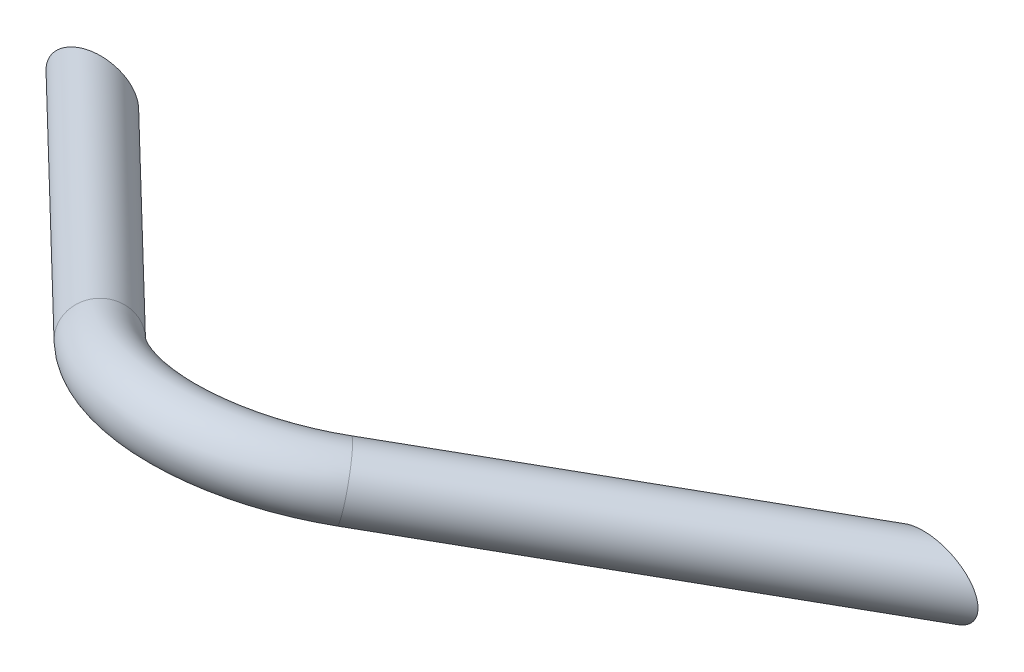
ISO-10303-21;
HEADER;
FILE_DESCRIPTION(('STEP AP214'),'2;1');
FILE_NAME('part.step','',(''),(''),'','','');
FILE_SCHEMA(('AUTOMOTIVE_DESIGN { 1 0 10303 214 1 1 1 1 }'));
ENDSEC;
DATA;
#1=APPLICATION_CONTEXT('core data for automotive mechanical design processes');
#2=APPLICATION_PROTOCOL_DEFINITION('international standard','automotive_design',2000,#1);
#3=PRODUCT_CONTEXT('',#1,'mechanical');
#4=PRODUCT('Part','Part','',(#3));
#5=PRODUCT_RELATED_PRODUCT_CATEGORY('part','',(#4));
#6=PRODUCT_DEFINITION_FORMATION('','',#4);
#7=PRODUCT_DEFINITION_CONTEXT('part definition',#1,'design');
#8=PRODUCT_DEFINITION('design','',#6,#7);
#9=PRODUCT_DEFINITION_SHAPE('','',#8);
#10=(LENGTH_UNIT() NAMED_UNIT(*) SI_UNIT(.MILLI.,.METRE.));
#11=(NAMED_UNIT(*) PLANE_ANGLE_UNIT() SI_UNIT($,.RADIAN.));
#12=(NAMED_UNIT(*) SI_UNIT($,.STERADIAN.) SOLID_ANGLE_UNIT());
#13=UNCERTAINTY_MEASURE_WITH_UNIT(LENGTH_MEASURE(1.E-05),#10,'distance_accuracy_value','');
#14=(GEOMETRIC_REPRESENTATION_CONTEXT(3) GLOBAL_UNCERTAINTY_ASSIGNED_CONTEXT((#13)) GLOBAL_UNIT_ASSIGNED_CONTEXT((#10,
#11,#12)) REPRESENTATION_CONTEXT('',''));
#15=CARTESIAN_POINT('',(0.,0.,0.));
#16=DIRECTION('',(0.,0.,1.));
#17=DIRECTION('',(1.,0.,0.));
#18=AXIS2_PLACEMENT_3D('',#15,#16,#17);
#19=CARTESIAN_POINT('',(228.97810114783,3.07089443601057,84.8810819781346));
#20=DIRECTION('',(0.,0.966420942740906,-0.256964124795229));
#21=DIRECTION('',(0.,0.256964124795229,0.966420942740906));
#22=AXIS2_PLACEMENT_3D('',#19,#20,#21);
#23=TOROIDAL_SURFACE('',#22,84.4977441648282,15.875);
#24=CARTESIAN_POINT('',(168.96518211042,18.3560880897538,142.367438381385));
#25=DIRECTION('',(0.703968676885562,0.182503892491773,0.686382132044055));
#26=DIRECTION('',(0.698106743490784,0.,-0.715993697383358));
#27=AXIS2_PLACEMENT_3D('',#24,#25,#26);
#28=CIRCLE('',#27,15.875);
#29=CARTESIAN_POINT('',(157.690264665754,21.2277913719129,153.167678280351));
#30=VERTEX_POINT('',#29);
#31=EDGE_CURVE('E40',#30,#30,#28,.F.);
#32=CARTESIAN_POINT('',(288.991020185241,18.3560880897538,142.367438381385));
#33=DIRECTION('',(0.703968676885562,-0.182503892491773,-0.686382132044055));
#34=DIRECTION('',(-0.698106743490784,0.,-0.715993697383358));
#35=AXIS2_PLACEMENT_3D('',#32,#33,#34);
#36=CIRCLE('',#35,15.875);
#37=CARTESIAN_POINT('',(300.265937629906,21.2277913719129,153.167678280351));
#38=VERTEX_POINT('',#37);
#39=EDGE_CURVE('E26',#38,#38,#36,.F.);
#40=CARTESIAN_POINT('',(228.97810114783,3.07089443601057,84.8810819781346));
#41=DIRECTION('',(0.,0.966420942740906,-0.256964124795229));
#42=DIRECTION('',(0.,0.256964124795229,0.966420942740906));
#43=AXIS2_PLACEMENT_3D('',#40,#41,#42);
#44=CIRCLE('',#43,100.372744164828);
#45=EDGE_CURVE('',#30,#38,#44,.T.);
#46=ORIENTED_EDGE('',*,*,#31,.F.);
#47=ORIENTED_EDGE('',*,*,#39,.T.);
#48=ORIENTED_EDGE('',*,*,#45,.T.);
#49=ORIENTED_EDGE('',*,*,#45,.F.);
#50=EDGE_LOOP('',(#46,#48,#47,#49));
#51=FACE_BOUND('',#50,.T.);
#52=ADVANCED_FACE('F13',(#51),#23,.T.);
#53=CARTESIAN_POINT('',(228.97810114783,3.07089443601057,84.8810819781346));
#54=DIRECTION('',(0.,0.966420942740906,-0.256964124795229));
#55=DIRECTION('',(0.,0.256964124795229,0.966420942740906));
#56=AXIS2_PLACEMENT_3D('',#53,#54,#55);
#57=TOROIDAL_SURFACE('',#56,84.4977441648282,14.2875);
#58=CARTESIAN_POINT('',(168.96518211042,18.3560880897538,142.367438381385));
#59=DIRECTION('',(0.703968676885562,0.182503892491773,0.686382132044055));
#60=DIRECTION('',(0.698106743490784,0.,-0.715993697383358));
#61=AXIS2_PLACEMENT_3D('',#58,#59,#60);
#62=CIRCLE('',#61,14.2875);
#63=CARTESIAN_POINT('',(158.817756410221,20.940621043697,152.087654290455));
#64=VERTEX_POINT('',#63);
#65=EDGE_CURVE('E30',#64,#64,#62,.F.);
#66=CARTESIAN_POINT('',(288.991020185241,18.3560880897538,142.367438381385));
#67=DIRECTION('',(0.703968676885562,-0.182503892491773,-0.686382132044055));
#68=DIRECTION('',(-0.698106743490784,0.,-0.715993697383358));
#69=AXIS2_PLACEMENT_3D('',#66,#67,#68);
#70=CIRCLE('',#69,14.2875);
#71=CARTESIAN_POINT('',(299.13844588544,20.940621043697,152.087654290455));
#72=VERTEX_POINT('',#71);
#73=EDGE_CURVE('E33',#72,#72,#70,.F.);
#74=CARTESIAN_POINT('',(228.97810114783,3.07089443601057,84.8810819781346));
#75=DIRECTION('',(0.,0.966420942740906,-0.256964124795229));
#76=DIRECTION('',(0.,0.256964124795229,0.966420942740906));
#77=AXIS2_PLACEMENT_3D('',#74,#75,#76);
#78=CIRCLE('',#77,98.7852441648282);
#79=EDGE_CURVE('',#64,#72,#78,.T.);
#80=ORIENTED_EDGE('',*,*,#65,.T.);
#81=ORIENTED_EDGE('',*,*,#73,.F.);
#82=ORIENTED_EDGE('',*,*,#79,.T.);
#83=ORIENTED_EDGE('',*,*,#79,.F.);
#84=EDGE_LOOP('',(#80,#82,#81,#83));
#85=FACE_BOUND('',#84,.T.);
#86=ADVANCED_FACE('F67',(#85),#57,.F.);
#87=CARTESIAN_POINT('',(458.9018,0.,0.));
#88=DIRECTION('',(0.,0.,-1.));
#89=DIRECTION('',(0.,1.,0.));
#90=AXIS2_PLACEMENT_3D('',#87,#88,#89);
#91=PLANE('',#90);
#92=CARTESIAN_POINT('',(22.9499923931885,-19.4983525427679,0.));
#93=DIRECTION('',(0.,0.,-1.));
#94=DIRECTION('',(0.967999071159672,0.250953777086563,0.));
#95=AXIS2_PLACEMENT_3D('',#92,#93,#94);
#96=ELLIPSE('',#95,20.815664238595,14.2875);
#97=CARTESIAN_POINT('',(43.09953604172,-14.2745829795268,0.));
#98=VERTEX_POINT('',#97);
#99=EDGE_CURVE('E35',#98,#98,#96,.T.);
#100=ORIENTED_EDGE('',*,*,#99,.F.);
#101=EDGE_LOOP('',(#100));
#102=FACE_BOUND('',#101,.T.);
#103=CARTESIAN_POINT('',(22.9499923931885,-19.4983525427679,0.));
#104=DIRECTION('',(0.,0.,-1.));
#105=DIRECTION('',(0.967999071159672,0.250953777086563,0.));
#106=AXIS2_PLACEMENT_3D('',#103,#104,#105);
#107=ELLIPSE('',#106,23.1285158206611,15.875);
#108=CARTESIAN_POINT('',(45.3383742248902,-13.6941641391667,0.));
#109=VERTEX_POINT('',#108);
#110=EDGE_CURVE('E21',#109,#109,#107,.T.);
#111=ORIENTED_EDGE('',*,*,#110,.T.);
#112=EDGE_LOOP('',(#111));
#113=FACE_BOUND('',#112,.T.);
#114=ADVANCED_FACE('F63',(#102,#113),#91,.T.);
#115=CARTESIAN_POINT('',(435.006209902472,-19.4983525427679,0.));
#116=DIRECTION('',(0.,0.,-1.));
#117=DIRECTION('',(0.967999071159672,-0.250953777086563,0.));
#118=AXIS2_PLACEMENT_3D('',#115,#116,#117);
#119=ELLIPSE('',#118,20.815664238595,14.2875);
#120=CARTESIAN_POINT('',(455.155753551004,-24.722122106009,0.));
#121=VERTEX_POINT('',#120);
#122=EDGE_CURVE('E17',#121,#121,#119,.T.);
#123=ORIENTED_EDGE('',*,*,#122,.F.);
#124=EDGE_LOOP('',(#123));
#125=FACE_BOUND('',#124,.T.);
#126=CARTESIAN_POINT('',(435.006209902472,-19.4983525427679,0.));
#127=DIRECTION('',(0.,0.,-1.));
#128=DIRECTION('',(0.967999071159672,-0.250953777086563,0.));
#129=AXIS2_PLACEMENT_3D('',#126,#127,#128);
#130=ELLIPSE('',#129,23.1285158206611,15.875);
#131=CARTESIAN_POINT('',(457.394591734174,-25.3025409463691,0.));
#132=VERTEX_POINT('',#131);
#133=EDGE_CURVE('E8',#132,#132,#130,.T.);
#134=ORIENTED_EDGE('',*,*,#133,.T.);
#135=EDGE_LOOP('',(#134));
#136=FACE_BOUND('',#135,.T.);
#137=ADVANCED_FACE('F53',(#125,#136),#91,.T.);
#138=CARTESIAN_POINT('',(286.584154974746,18.980067940053,144.714175287395));
#139=DIRECTION('',(0.703968676885562,-0.182503892491773,-0.686382132044055));
#140=DIRECTION('',(-0.698939519635838,-0.00637647696010319,-0.715152353301589));
#141=AXIS2_PLACEMENT_3D('',#138,#139,#140);
#142=CYLINDRICAL_SURFACE('',#141,15.875);
#143=ORIENTED_EDGE('',*,*,#133,.F.);
#144=EDGE_LOOP('',(#143));
#145=FACE_BOUND('',#144,.T.);
#146=ORIENTED_EDGE('',*,*,#39,.F.);
#147=EDGE_LOOP('',(#146));
#148=FACE_BOUND('',#147,.T.);
#149=ADVANCED_FACE('F15',(#145,#148),#142,.T.);
#150=CARTESIAN_POINT('',(233.93480076407,35.1994629263374,205.713986081307));
#151=DIRECTION('',(0.703968676885562,0.182503892491773,0.686382132044055));
#152=DIRECTION('',(0.698939519635838,-0.00637647696010318,-0.715152353301589));
#153=AXIS2_PLACEMENT_3D('',#150,#151,#152);
#154=CYLINDRICAL_SURFACE('',#153,15.875);
#155=ORIENTED_EDGE('',*,*,#110,.F.);
#156=EDGE_LOOP('',(#155));
#157=FACE_BOUND('',#156,.T.);
#158=ORIENTED_EDGE('',*,*,#31,.T.);
#159=EDGE_LOOP('',(#158));
#160=FACE_BOUND('',#159,.T.);
#161=ADVANCED_FACE('F52',(#157,#160),#154,.T.);
#162=CARTESIAN_POINT('',(286.584154974746,18.980067940053,144.714175287395));
#163=DIRECTION('',(0.703968676885562,-0.182503892491773,-0.686382132044055));
#164=DIRECTION('',(-0.698939519635838,-0.00637647696010319,-0.715152353301589));
#165=AXIS2_PLACEMENT_3D('',#162,#163,#164);
#166=CYLINDRICAL_SURFACE('',#165,14.2875);
#167=ORIENTED_EDGE('',*,*,#122,.T.);
#168=EDGE_LOOP('',(#167));
#169=FACE_BOUND('',#168,.T.);
#170=ORIENTED_EDGE('',*,*,#73,.T.);
#171=EDGE_LOOP('',(#170));
#172=FACE_BOUND('',#171,.T.);
#173=ADVANCED_FACE('F60',(#169,#172),#166,.F.);
#174=CARTESIAN_POINT('',(233.93480076407,35.1994629263374,205.713986081307));
#175=DIRECTION('',(0.703968676885562,0.182503892491773,0.686382132044055));
#176=DIRECTION('',(0.698939519635838,-0.00637647696010318,-0.715152353301589));
#177=AXIS2_PLACEMENT_3D('',#174,#175,#176);
#178=CYLINDRICAL_SURFACE('',#177,14.2875);
#179=ORIENTED_EDGE('',*,*,#99,.T.);
#180=EDGE_LOOP('',(#179));
#181=FACE_BOUND('',#180,.T.);
#182=ORIENTED_EDGE('',*,*,#65,.F.);
#183=EDGE_LOOP('',(#182));
#184=FACE_BOUND('',#183,.T.);
#185=ADVANCED_FACE('F77',(#181,#184),#178,.F.);
#186=CLOSED_SHELL('',(#52,#86,#114,#137,#149,#161,#173,#185));
#187=MANIFOLD_SOLID_BREP('B1',#186);
#188=ADVANCED_BREP_SHAPE_REPRESENTATION('',(#18,#187),#14);
#189=SHAPE_DEFINITION_REPRESENTATION(#9,#188);
ENDSEC;
END-ISO-10303-21;
